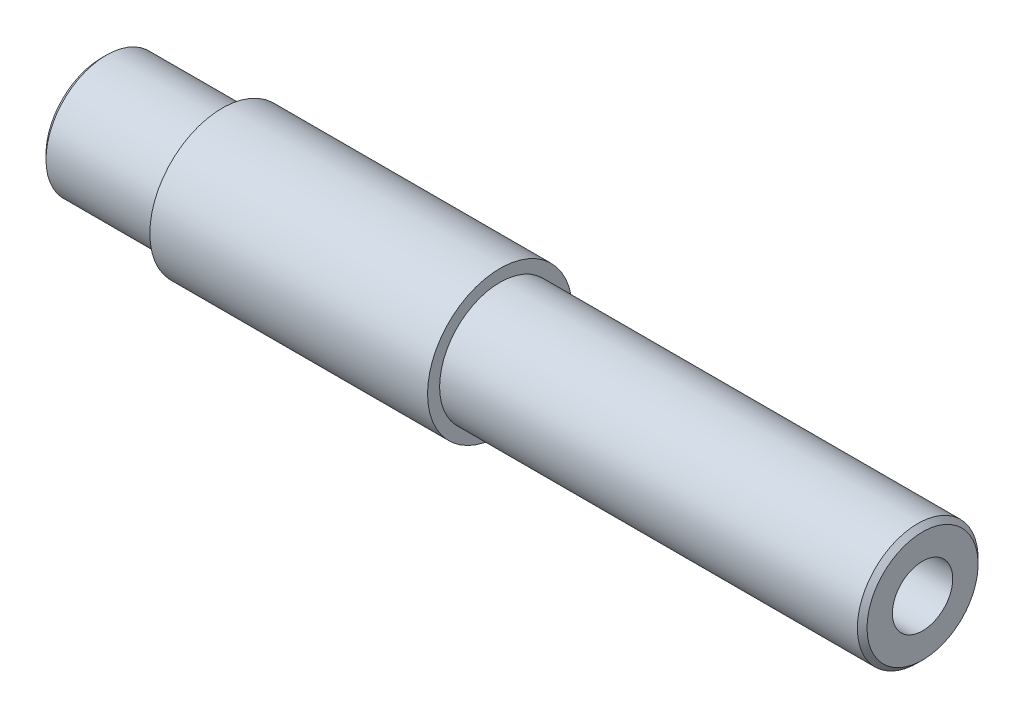
ISO-10303-21;
HEADER;
FILE_DESCRIPTION(('STEP AP214'),'2;1');
FILE_NAME('part.step','',(''),(''),'','','');
FILE_SCHEMA(('AUTOMOTIVE_DESIGN { 1 0 10303 214 1 1 1 1 }'));
ENDSEC;
DATA;
#1=APPLICATION_CONTEXT('core data for automotive mechanical design processes');
#2=APPLICATION_PROTOCOL_DEFINITION('international standard','automotive_design',2000,#1);
#3=PRODUCT_CONTEXT('',#1,'mechanical');
#4=PRODUCT('Part','Part','',(#3));
#5=PRODUCT_RELATED_PRODUCT_CATEGORY('part','',(#4));
#6=PRODUCT_DEFINITION_FORMATION('','',#4);
#7=PRODUCT_DEFINITION_CONTEXT('part definition',#1,'design');
#8=PRODUCT_DEFINITION('design','',#6,#7);
#9=PRODUCT_DEFINITION_SHAPE('','',#8);
#10=(LENGTH_UNIT() NAMED_UNIT(*) SI_UNIT(.MILLI.,.METRE.));
#11=(NAMED_UNIT(*) PLANE_ANGLE_UNIT() SI_UNIT($,.RADIAN.));
#12=(NAMED_UNIT(*) SI_UNIT($,.STERADIAN.) SOLID_ANGLE_UNIT());
#13=UNCERTAINTY_MEASURE_WITH_UNIT(LENGTH_MEASURE(1.E-05),#10,'distance_accuracy_value','');
#14=(GEOMETRIC_REPRESENTATION_CONTEXT(3) GLOBAL_UNCERTAINTY_ASSIGNED_CONTEXT((#13)) GLOBAL_UNIT_ASSIGNED_CONTEXT((#10,
#11,#12)) REPRESENTATION_CONTEXT('',''));
#15=CARTESIAN_POINT('',(0.,0.,0.));
#16=DIRECTION('',(0.,0.,1.));
#17=DIRECTION('',(1.,0.,0.));
#18=AXIS2_PLACEMENT_3D('',#15,#16,#17);
#19=CARTESIAN_POINT('',(-17.,0.,0.));
#20=DIRECTION('',(-1.,0.,0.));
#21=DIRECTION('',(0.,0.,1.));
#22=AXIS2_PLACEMENT_3D('',#19,#20,#21);
#23=CYLINDRICAL_SURFACE('',#22,3.);
#24=CARTESIAN_POINT('',(-0.5,0.,0.));
#25=DIRECTION('',(-1.,0.,0.));
#26=DIRECTION('',(0.,0.,1.));
#27=AXIS2_PLACEMENT_3D('',#24,#25,#26);
#28=CIRCLE('',#27,3.);
#29=CARTESIAN_POINT('',(-0.5,0.,3.));
#30=VERTEX_POINT('',#29);
#31=EDGE_CURVE('E82',#30,#30,#28,.T.);
#32=ORIENTED_EDGE('',*,*,#31,.T.);
#33=EDGE_LOOP('',(#32));
#34=FACE_BOUND('',#33,.T.);
#35=CARTESIAN_POINT('',(-12.,0.,0.));
#36=DIRECTION('',(-1.,0.,0.));
#37=DIRECTION('',(0.,0.,1.));
#38=AXIS2_PLACEMENT_3D('',#35,#36,#37);
#39=CIRCLE('',#38,3.);
#40=CARTESIAN_POINT('',(-12.,0.,3.));
#41=VERTEX_POINT('',#40);
#42=EDGE_CURVE('E65',#41,#41,#39,.T.);
#43=ORIENTED_EDGE('',*,*,#42,.F.);
#44=EDGE_LOOP('',(#43));
#45=FACE_BOUND('',#44,.T.);
#46=ADVANCED_FACE('F42',(#34,#45),#23,.T.);
#47=CARTESIAN_POINT('',(17.,0.,0.));
#48=DIRECTION('',(-1.,0.,0.));
#49=DIRECTION('',(0.,0.,1.));
#50=AXIS2_PLACEMENT_3D('',#47,#48,#49);
#51=PLANE('',#50);
#52=CARTESIAN_POINT('',(17.,0.,0.));
#53=DIRECTION('',(-1.,0.,0.));
#54=DIRECTION('',(0.,0.,1.));
#55=AXIS2_PLACEMENT_3D('',#52,#53,#54);
#56=CIRCLE('',#55,2.30000000000002);
#57=CARTESIAN_POINT('',(17.,0.,2.30000000000002));
#58=VERTEX_POINT('',#57);
#59=EDGE_CURVE('E91',#58,#58,#56,.F.);
#60=ORIENTED_EDGE('',*,*,#59,.T.);
#61=EDGE_LOOP('',(#60));
#62=FACE_BOUND('',#61,.T.);
#63=CARTESIAN_POINT('',(17.,0.,0.));
#64=DIRECTION('',(1.,0.,0.));
#65=DIRECTION('',(0.,0.,-1.));
#66=AXIS2_PLACEMENT_3D('',#63,#64,#65);
#67=CIRCLE('',#66,1.24999999999999);
#68=CARTESIAN_POINT('',(17.,0.,-1.24999999999999));
#69=VERTEX_POINT('',#68);
#70=EDGE_CURVE('E76',#69,#69,#67,.T.);
#71=ORIENTED_EDGE('',*,*,#70,.F.);
#72=EDGE_LOOP('',(#71));
#73=FACE_BOUND('',#72,.T.);
#74=ADVANCED_FACE('F107',(#62,#73),#51,.F.);
#75=CARTESIAN_POINT('',(-17.,0.,0.));
#76=DIRECTION('',(-1.,0.,0.));
#77=DIRECTION('',(0.,0.,1.));
#78=AXIS2_PLACEMENT_3D('',#75,#76,#77);
#79=CYLINDRICAL_SURFACE('',#78,2.5);
#80=CARTESIAN_POINT('',(16.8,0.,0.));
#81=DIRECTION('',(-1.,0.,0.));
#82=DIRECTION('',(0.,0.,1.));
#83=AXIS2_PLACEMENT_3D('',#80,#81,#82);
#84=CIRCLE('',#83,2.5);
#85=CARTESIAN_POINT('',(16.8,0.,2.5));
#86=VERTEX_POINT('',#85);
#87=EDGE_CURVE('E88',#86,#86,#84,.T.);
#88=ORIENTED_EDGE('',*,*,#87,.T.);
#89=EDGE_LOOP('',(#88));
#90=FACE_BOUND('',#89,.T.);
#91=CARTESIAN_POINT('',(-0.5,0.,0.));
#92=DIRECTION('',(-1.,0.,0.));
#93=DIRECTION('',(0.,0.,1.));
#94=AXIS2_PLACEMENT_3D('',#91,#92,#93);
#95=CIRCLE('',#94,2.5);
#96=CARTESIAN_POINT('',(-0.5,0.,2.5));
#97=VERTEX_POINT('',#96);
#98=EDGE_CURVE('E85',#97,#97,#95,.T.);
#99=ORIENTED_EDGE('',*,*,#98,.F.);
#100=EDGE_LOOP('',(#99));
#101=FACE_BOUND('',#100,.T.);
#102=ADVANCED_FACE('F113',(#90,#101),#79,.T.);
#103=CARTESIAN_POINT('',(-0.500000000000001,2.5,0.));
#104=DIRECTION('',(-1.,0.,0.));
#105=DIRECTION('',(0.,0.,1.));
#106=AXIS2_PLACEMENT_3D('',#103,#104,#105);
#107=PLANE('',#106);
#108=ORIENTED_EDGE('',*,*,#31,.F.);
#109=EDGE_LOOP('',(#108));
#110=FACE_BOUND('',#109,.T.);
#111=ORIENTED_EDGE('',*,*,#98,.T.);
#112=EDGE_LOOP('',(#111));
#113=FACE_BOUND('',#112,.T.);
#114=ADVANCED_FACE('F120',(#110,#113),#107,.F.);
#115=CARTESIAN_POINT('',(9.,0.,0.));
#116=DIRECTION('',(1.,0.,0.));
#117=DIRECTION('',(0.,0.,-1.));
#118=AXIS2_PLACEMENT_3D('',#115,#116,#117);
#119=CONICAL_SURFACE('',#118,1.25,1.02974425867665);
#120=CARTESIAN_POINT('',(8.24892422621555,0.,0.));
#121=VERTEX_POINT('',#120);
#122=VERTEX_LOOP('',#121);
#123=FACE_BOUND('',#122,.T.);
#124=CARTESIAN_POINT('',(9.,0.,0.));
#125=DIRECTION('',(1.,0.,0.));
#126=DIRECTION('',(0.,0.,-1.));
#127=AXIS2_PLACEMENT_3D('',#124,#125,#126);
#128=CIRCLE('',#127,1.25);
#129=CARTESIAN_POINT('',(9.,0.,-1.25));
#130=VERTEX_POINT('',#129);
#131=EDGE_CURVE('E79',#130,#130,#128,.T.);
#132=ORIENTED_EDGE('',*,*,#131,.T.);
#133=EDGE_LOOP('',(#132));
#134=FACE_BOUND('',#133,.T.);
#135=ADVANCED_FACE('F123',(#123,#134),#119,.F.);
#136=CARTESIAN_POINT('',(17.,0.,0.));
#137=DIRECTION('',(1.,0.,0.));
#138=DIRECTION('',(0.,0.,-1.));
#139=AXIS2_PLACEMENT_3D('',#136,#137,#138);
#140=CYLINDRICAL_SURFACE('',#139,1.24999999999999);
#141=ORIENTED_EDGE('',*,*,#131,.F.);
#142=EDGE_LOOP('',(#141));
#143=FACE_BOUND('',#142,.T.);
#144=ORIENTED_EDGE('',*,*,#70,.T.);
#145=EDGE_LOOP('',(#144));
#146=FACE_BOUND('',#145,.T.);
#147=ADVANCED_FACE('F147',(#143,#146),#140,.F.);
#148=CARTESIAN_POINT('',(-17.,0.,0.));
#149=DIRECTION('',(-1.,0.,0.));
#150=DIRECTION('',(0.,0.,1.));
#151=AXIS2_PLACEMENT_3D('',#148,#149,#150);
#152=CYLINDRICAL_SURFACE('',#151,2.5);
#153=CARTESIAN_POINT('',(-16.8,0.,0.));
#154=DIRECTION('',(1.,0.,0.));
#155=DIRECTION('',(0.,0.,-1.));
#156=AXIS2_PLACEMENT_3D('',#153,#154,#155);
#157=CIRCLE('',#156,2.5);
#158=CARTESIAN_POINT('',(-16.8,0.,-2.5));
#159=VERTEX_POINT('',#158);
#160=EDGE_CURVE('E11',#159,#159,#157,.T.);
#161=ORIENTED_EDGE('',*,*,#160,.T.);
#162=EDGE_LOOP('',(#161));
#163=FACE_BOUND('',#162,.T.);
#164=CARTESIAN_POINT('',(-12.,0.,0.));
#165=DIRECTION('',(-1.,0.,0.));
#166=DIRECTION('',(0.,0.,1.));
#167=AXIS2_PLACEMENT_3D('',#164,#165,#166);
#168=CIRCLE('',#167,2.5);
#169=CARTESIAN_POINT('',(-12.,0.,2.5));
#170=VERTEX_POINT('',#169);
#171=EDGE_CURVE('E69',#170,#170,#168,.T.);
#172=ORIENTED_EDGE('',*,*,#171,.T.);
#173=EDGE_LOOP('',(#172));
#174=FACE_BOUND('',#173,.T.);
#175=ADVANCED_FACE('F154',(#163,#174),#152,.T.);
#176=CARTESIAN_POINT('',(-12.,3.,0.));
#177=DIRECTION('',(-1.,0.,0.));
#178=DIRECTION('',(0.,0.,1.));
#179=AXIS2_PLACEMENT_3D('',#176,#177,#178);
#180=PLANE('',#179);
#181=ORIENTED_EDGE('',*,*,#42,.T.);
#182=EDGE_LOOP('',(#181));
#183=FACE_BOUND('',#182,.T.);
#184=ORIENTED_EDGE('',*,*,#171,.F.);
#185=EDGE_LOOP('',(#184));
#186=FACE_BOUND('',#185,.T.);
#187=ADVANCED_FACE('F162',(#183,#186),#180,.T.);
#188=CARTESIAN_POINT('',(-17.,3.,0.));
#189=DIRECTION('',(1.,0.,0.));
#190=DIRECTION('',(0.,0.,-1.));
#191=AXIS2_PLACEMENT_3D('',#188,#189,#190);
#192=PLANE('',#191);
#193=CARTESIAN_POINT('',(-17.,0.,0.));
#194=DIRECTION('',(-1.,0.,0.));
#195=DIRECTION('',(0.,0.,1.));
#196=AXIS2_PLACEMENT_3D('',#193,#194,#195);
#197=CIRCLE('',#196,1.25);
#198=CARTESIAN_POINT('',(-17.,0.,1.25));
#199=VERTEX_POINT('',#198);
#200=EDGE_CURVE('E66',#199,#199,#197,.T.);
#201=ORIENTED_EDGE('',*,*,#200,.F.);
#202=EDGE_LOOP('',(#201));
#203=FACE_BOUND('',#202,.T.);
#204=CARTESIAN_POINT('',(-17.,0.,0.));
#205=DIRECTION('',(1.,0.,0.));
#206=DIRECTION('',(0.,0.,-1.));
#207=AXIS2_PLACEMENT_3D('',#204,#205,#206);
#208=CIRCLE('',#207,2.29999999999999);
#209=CARTESIAN_POINT('',(-17.,0.,-2.29999999999999));
#210=VERTEX_POINT('',#209);
#211=EDGE_CURVE('E50',#210,#210,#208,.F.);
#212=ORIENTED_EDGE('',*,*,#211,.T.);
#213=EDGE_LOOP('',(#212));
#214=FACE_BOUND('',#213,.T.);
#215=ADVANCED_FACE('F96',(#203,#214),#192,.F.);
#216=CARTESIAN_POINT('',(16.8,0.,0.));
#217=DIRECTION('',(-1.,0.,0.));
#218=DIRECTION('',(0.,0.,1.));
#219=AXIS2_PLACEMENT_3D('',#216,#217,#218);
#220=CONICAL_SURFACE('',#219,2.5,0.785398163397433);
#221=ORIENTED_EDGE('',*,*,#59,.F.);
#222=EDGE_LOOP('',(#221));
#223=FACE_BOUND('',#222,.T.);
#224=ORIENTED_EDGE('',*,*,#87,.F.);
#225=EDGE_LOOP('',(#224));
#226=FACE_BOUND('',#225,.T.);
#227=ADVANCED_FACE('F99',(#223,#226),#220,.T.);
#228=CARTESIAN_POINT('',(-17.,0.,0.));
#229=DIRECTION('',(1.,0.,0.));
#230=DIRECTION('',(0.,0.,-1.));
#231=AXIS2_PLACEMENT_3D('',#228,#229,#230);
#232=CONICAL_SURFACE('',#231,2.29999999999999,0.785398163397451);
#233=ORIENTED_EDGE('',*,*,#160,.F.);
#234=EDGE_LOOP('',(#233));
#235=FACE_BOUND('',#234,.T.);
#236=ORIENTED_EDGE('',*,*,#211,.F.);
#237=EDGE_LOOP('',(#236));
#238=FACE_BOUND('',#237,.T.);
#239=ADVANCED_FACE('F44',(#235,#238),#232,.T.);
#240=CARTESIAN_POINT('',(-9.,0.,0.));
#241=DIRECTION('',(-1.,0.,0.));
#242=DIRECTION('',(0.,0.,1.));
#243=AXIS2_PLACEMENT_3D('',#240,#241,#242);
#244=CONICAL_SURFACE('',#243,1.25,1.02974425867665);
#245=CARTESIAN_POINT('',(-8.24892422621555,0.,0.));
#246=VERTEX_POINT('',#245);
#247=VERTEX_LOOP('',#246);
#248=FACE_BOUND('',#247,.T.);
#249=CARTESIAN_POINT('',(-9.,0.,0.));
#250=DIRECTION('',(-1.,0.,0.));
#251=DIRECTION('',(0.,0.,1.));
#252=AXIS2_PLACEMENT_3D('',#249,#250,#251);
#253=CIRCLE('',#252,1.25);
#254=CARTESIAN_POINT('',(-9.,0.,1.25));
#255=VERTEX_POINT('',#254);
#256=EDGE_CURVE('E63',#255,#255,#253,.T.);
#257=ORIENTED_EDGE('',*,*,#256,.T.);
#258=EDGE_LOOP('',(#257));
#259=FACE_BOUND('',#258,.T.);
#260=ADVANCED_FACE('F56',(#248,#259),#244,.F.);
#261=CARTESIAN_POINT('',(-17.,0.,0.));
#262=DIRECTION('',(-1.,0.,0.));
#263=DIRECTION('',(0.,0.,1.));
#264=AXIS2_PLACEMENT_3D('',#261,#262,#263);
#265=CYLINDRICAL_SURFACE('',#264,1.25);
#266=ORIENTED_EDGE('',*,*,#256,.F.);
#267=EDGE_LOOP('',(#266));
#268=FACE_BOUND('',#267,.T.);
#269=ORIENTED_EDGE('',*,*,#200,.T.);
#270=EDGE_LOOP('',(#269));
#271=FACE_BOUND('',#270,.T.);
#272=ADVANCED_FACE('F59',(#268,#271),#265,.F.);
#273=CLOSED_SHELL('',(#46,#74,#102,#114,#135,#147,#175,#187,#215,#227,#239,#260,#272));
#274=MANIFOLD_SOLID_BREP('B2',#273);
#275=ADVANCED_BREP_SHAPE_REPRESENTATION('',(#18,#274),#14);
#276=SHAPE_DEFINITION_REPRESENTATION(#9,#275);
ENDSEC;
END-ISO-10303-21;
